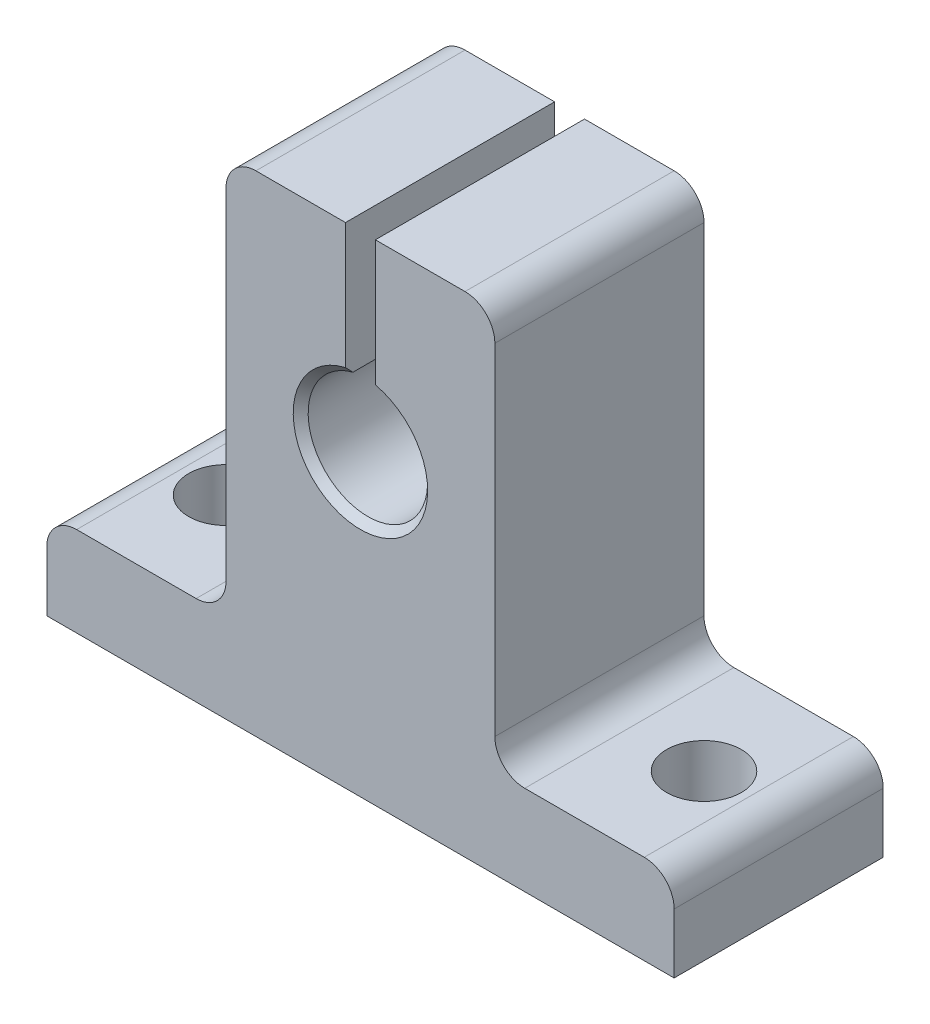
ISO-10303-21;
HEADER;
FILE_DESCRIPTION(('STEP AP214'),'2;1');
FILE_NAME('part.step','',(''),(''),'','','');
FILE_SCHEMA(('AUTOMOTIVE_DESIGN { 1 0 10303 214 1 1 1 1 }'));
ENDSEC;
DATA;
#1=APPLICATION_CONTEXT('core data for automotive mechanical design processes');
#2=APPLICATION_PROTOCOL_DEFINITION('international standard','automotive_design',2000,#1);
#3=PRODUCT_CONTEXT('',#1,'mechanical');
#4=PRODUCT('Part','Part','',(#3));
#5=PRODUCT_RELATED_PRODUCT_CATEGORY('part','',(#4));
#6=PRODUCT_DEFINITION_FORMATION('','',#4);
#7=PRODUCT_DEFINITION_CONTEXT('part definition',#1,'design');
#8=PRODUCT_DEFINITION('design','',#6,#7);
#9=PRODUCT_DEFINITION_SHAPE('','',#8);
#10=(LENGTH_UNIT() NAMED_UNIT(*) SI_UNIT(.MILLI.,.METRE.));
#11=(NAMED_UNIT(*) PLANE_ANGLE_UNIT() SI_UNIT($,.RADIAN.));
#12=(NAMED_UNIT(*) SI_UNIT($,.STERADIAN.) SOLID_ANGLE_UNIT());
#13=UNCERTAINTY_MEASURE_WITH_UNIT(LENGTH_MEASURE(1.E-05),#10,'distance_accuracy_value','');
#14=(GEOMETRIC_REPRESENTATION_CONTEXT(3) GLOBAL_UNCERTAINTY_ASSIGNED_CONTEXT((#13)) GLOBAL_UNIT_ASSIGNED_CONTEXT((#10,
#11,#12)) REPRESENTATION_CONTEXT('',''));
#15=CARTESIAN_POINT('',(0.,0.,0.));
#16=DIRECTION('',(0.,0.,1.));
#17=DIRECTION('',(1.,0.,0.));
#18=AXIS2_PLACEMENT_3D('',#15,#16,#17);
#19=CARTESIAN_POINT('',(-21.,0.,14.));
#20=DIRECTION('',(0.,1.,0.));
#21=DIRECTION('',(-1.,0.,0.));
#22=AXIS2_PLACEMENT_3D('',#19,#20,#21);
#23=PLANE('',#22);
#24=CARTESIAN_POINT('',(-16.,0.,7.));
#25=DIRECTION('',(0.,1.,0.));
#26=DIRECTION('',(0.,0.,1.));
#27=AXIS2_PLACEMENT_3D('',#24,#25,#26);
#28=CIRCLE('',#27,2.5);
#29=CARTESIAN_POINT('',(-16.,0.,9.5));
#30=VERTEX_POINT('',#29);
#31=EDGE_CURVE('E420',#30,#30,#28,.T.);
#32=ORIENTED_EDGE('',*,*,#31,.T.);
#33=EDGE_LOOP('',(#32));
#34=FACE_BOUND('',#33,.T.);
#35=CARTESIAN_POINT('',(16.,0.,7.));
#36=DIRECTION('',(0.,1.,0.));
#37=DIRECTION('',(0.,0.,1.));
#38=AXIS2_PLACEMENT_3D('',#35,#36,#37);
#39=CIRCLE('',#38,2.5);
#40=CARTESIAN_POINT('',(16.,0.,9.5));
#41=VERTEX_POINT('',#40);
#42=EDGE_CURVE('E413',#41,#41,#39,.T.);
#43=ORIENTED_EDGE('',*,*,#42,.T.);
#44=EDGE_LOOP('',(#43));
#45=FACE_BOUND('',#44,.T.);
#46=DIRECTION('',(1.,0.,0.));
#47=VECTOR('',#46,1.);
#48=CARTESIAN_POINT('',(-21.,0.,0.));
#49=LINE('',#48,#47);
#50=CARTESIAN_POINT('',(-21.,0.,0.));
#51=VERTEX_POINT('',#50);
#52=CARTESIAN_POINT('',(21.,0.,0.));
#53=VERTEX_POINT('',#52);
#54=EDGE_CURVE('E203',#51,#53,#49,.T.);
#55=ORIENTED_EDGE('',*,*,#54,.T.);
#56=DIRECTION('',(0.,0.,-1.));
#57=VECTOR('',#56,1.);
#58=CARTESIAN_POINT('',(21.,0.,14.));
#59=LINE('',#58,#57);
#60=CARTESIAN_POINT('',(21.,0.,14.));
#61=VERTEX_POINT('',#60);
#62=EDGE_CURVE('E184',#61,#53,#59,.T.);
#63=ORIENTED_EDGE('',*,*,#62,.F.);
#64=DIRECTION('',(1.,0.,0.));
#65=VECTOR('',#64,1.);
#66=CARTESIAN_POINT('',(-21.,0.,14.));
#67=LINE('',#66,#65);
#68=CARTESIAN_POINT('',(-21.,0.,14.));
#69=VERTEX_POINT('',#68);
#70=EDGE_CURVE('E191',#69,#61,#67,.T.);
#71=ORIENTED_EDGE('',*,*,#70,.F.);
#72=DIRECTION('',(0.,0.,-1.));
#73=VECTOR('',#72,1.);
#74=CARTESIAN_POINT('',(-21.,0.,14.));
#75=LINE('',#74,#73);
#76=EDGE_CURVE('E330',#69,#51,#75,.T.);
#77=ORIENTED_EDGE('',*,*,#76,.T.);
#78=EDGE_LOOP('',(#55,#63,#71,#77));
#79=FACE_BOUND('',#78,.T.);
#80=ADVANCED_FACE('F38',(#34,#45,#79),#23,.F.);
#81=CARTESIAN_POINT('',(21.,0.,14.));
#82=DIRECTION('',(-1.,0.,0.));
#83=DIRECTION('',(0.,0.,1.));
#84=AXIS2_PLACEMENT_3D('',#81,#82,#83);
#85=PLANE('',#84);
#86=DIRECTION('',(0.,1.,0.));
#87=VECTOR('',#86,1.);
#88=CARTESIAN_POINT('',(21.,0.,0.));
#89=LINE('',#88,#87);
#90=CARTESIAN_POINT('',(21.,4.,0.));
#91=VERTEX_POINT('',#90);
#92=EDGE_CURVE('E380',#53,#91,#89,.T.);
#93=ORIENTED_EDGE('',*,*,#92,.T.);
#94=DIRECTION('',(0.,0.,-1.));
#95=VECTOR('',#94,1.);
#96=CARTESIAN_POINT('',(21.,4.,14.));
#97=LINE('',#96,#95);
#98=CARTESIAN_POINT('',(21.,4.,14.));
#99=VERTEX_POINT('',#98);
#100=EDGE_CURVE('E187',#99,#91,#97,.T.);
#101=ORIENTED_EDGE('',*,*,#100,.F.);
#102=DIRECTION('',(0.,1.,0.));
#103=VECTOR('',#102,1.);
#104=CARTESIAN_POINT('',(21.,0.,14.));
#105=LINE('',#104,#103);
#106=EDGE_CURVE('E180',#61,#99,#105,.T.);
#107=ORIENTED_EDGE('',*,*,#106,.F.);
#108=ORIENTED_EDGE('',*,*,#62,.T.);
#109=EDGE_LOOP('',(#93,#101,#107,#108));
#110=FACE_BOUND('',#109,.T.);
#111=ADVANCED_FACE('F182',(#110),#85,.F.);
#112=CARTESIAN_POINT('',(19.,4.00000000000001,14.));
#113=DIRECTION('',(0.,0.,-1.));
#114=DIRECTION('',(-1.,0.,0.));
#115=AXIS2_PLACEMENT_3D('',#112,#113,#114);
#116=CYLINDRICAL_SURFACE('',#115,2.);
#117=CARTESIAN_POINT('',(19.,4.00000000000001,0.));
#118=DIRECTION('',(0.,0.,1.));
#119=DIRECTION('',(1.,0.,0.));
#120=AXIS2_PLACEMENT_3D('',#117,#118,#119);
#121=CIRCLE('',#120,2.);
#122=CARTESIAN_POINT('',(19.,6.00000000000001,0.));
#123=VERTEX_POINT('',#122);
#124=EDGE_CURVE('E376',#91,#123,#121,.T.);
#125=ORIENTED_EDGE('',*,*,#124,.T.);
#126=DIRECTION('',(0.,0.,-1.));
#127=VECTOR('',#126,1.);
#128=CARTESIAN_POINT('',(19.,6.00000000000001,14.));
#129=LINE('',#128,#127);
#130=CARTESIAN_POINT('',(19.,6.00000000000001,14.));
#131=VERTEX_POINT('',#130);
#132=EDGE_CURVE('E208',#131,#123,#129,.T.);
#133=ORIENTED_EDGE('',*,*,#132,.F.);
#134=CARTESIAN_POINT('',(19.,4.00000000000001,14.));
#135=DIRECTION('',(0.,0.,1.));
#136=DIRECTION('',(1.,0.,0.));
#137=AXIS2_PLACEMENT_3D('',#134,#135,#136);
#138=CIRCLE('',#137,2.);
#139=EDGE_CURVE('E190',#99,#131,#138,.T.);
#140=ORIENTED_EDGE('',*,*,#139,.F.);
#141=ORIENTED_EDGE('',*,*,#100,.T.);
#142=EDGE_LOOP('',(#125,#133,#140,#141));
#143=FACE_BOUND('',#142,.T.);
#144=ADVANCED_FACE('F268',(#143),#116,.T.);
#145=CARTESIAN_POINT('',(19.,6.00000000000001,14.));
#146=DIRECTION('',(0.,-1.,0.));
#147=DIRECTION('',(1.,0.,0.));
#148=AXIS2_PLACEMENT_3D('',#145,#146,#147);
#149=PLANE('',#148);
#150=CARTESIAN_POINT('',(16.,6.00000000000002,7.));
#151=DIRECTION('',(0.,1.,0.));
#152=DIRECTION('',(0.,0.,1.));
#153=AXIS2_PLACEMENT_3D('',#150,#151,#152);
#154=CIRCLE('',#153,2.5);
#155=CARTESIAN_POINT('',(16.,6.00000000000002,9.5));
#156=VERTEX_POINT('',#155);
#157=EDGE_CURVE('E417',#156,#156,#154,.T.);
#158=ORIENTED_EDGE('',*,*,#157,.F.);
#159=EDGE_LOOP('',(#158));
#160=FACE_BOUND('',#159,.T.);
#161=DIRECTION('',(-1.,0.,0.));
#162=VECTOR('',#161,1.);
#163=CARTESIAN_POINT('',(19.,6.00000000000001,0.));
#164=LINE('',#163,#162);
#165=CARTESIAN_POINT('',(11.,6.00000000000001,0.));
#166=VERTEX_POINT('',#165);
#167=EDGE_CURVE('E372',#123,#166,#164,.T.);
#168=ORIENTED_EDGE('',*,*,#167,.T.);
#169=DIRECTION('',(0.,0.,-1.));
#170=VECTOR('',#169,1.);
#171=CARTESIAN_POINT('',(11.,6.00000000000001,14.));
#172=LINE('',#171,#170);
#173=CARTESIAN_POINT('',(11.,6.00000000000001,14.));
#174=VERTEX_POINT('',#173);
#175=EDGE_CURVE('E364',#174,#166,#172,.T.);
#176=ORIENTED_EDGE('',*,*,#175,.F.);
#177=DIRECTION('',(-1.,0.,0.));
#178=VECTOR('',#177,1.);
#179=CARTESIAN_POINT('',(19.,6.00000000000001,14.));
#180=LINE('',#179,#178);
#181=EDGE_CURVE('E373',#131,#174,#180,.T.);
#182=ORIENTED_EDGE('',*,*,#181,.F.);
#183=ORIENTED_EDGE('',*,*,#132,.T.);
#184=EDGE_LOOP('',(#168,#176,#182,#183));
#185=FACE_BOUND('',#184,.T.);
#186=ADVANCED_FACE('F271',(#160,#185),#149,.F.);
#187=CARTESIAN_POINT('',(11.,8.00000000000001,14.));
#188=DIRECTION('',(0.,0.,-1.));
#189=DIRECTION('',(-1.,0.,0.));
#190=AXIS2_PLACEMENT_3D('',#187,#188,#189);
#191=CYLINDRICAL_SURFACE('',#190,2.);
#192=CARTESIAN_POINT('',(11.,8.00000000000001,0.));
#193=DIRECTION('',(0.,0.,-1.));
#194=DIRECTION('',(-1.,0.,0.));
#195=AXIS2_PLACEMENT_3D('',#192,#193,#194);
#196=CIRCLE('',#195,2.);
#197=CARTESIAN_POINT('',(9.,8.00000000000002,0.));
#198=VERTEX_POINT('',#197);
#199=EDGE_CURVE('E377',#166,#198,#196,.T.);
#200=ORIENTED_EDGE('',*,*,#199,.T.);
#201=DIRECTION('',(0.,0.,-1.));
#202=VECTOR('',#201,1.);
#203=CARTESIAN_POINT('',(9.,8.00000000000002,14.));
#204=LINE('',#203,#202);
#205=CARTESIAN_POINT('',(9.,8.00000000000002,14.));
#206=VERTEX_POINT('',#205);
#207=EDGE_CURVE('E361',#206,#198,#204,.T.);
#208=ORIENTED_EDGE('',*,*,#207,.F.);
#209=CARTESIAN_POINT('',(11.,8.00000000000001,14.));
#210=DIRECTION('',(0.,0.,-1.));
#211=DIRECTION('',(-1.,0.,0.));
#212=AXIS2_PLACEMENT_3D('',#209,#210,#211);
#213=CIRCLE('',#212,2.);
#214=EDGE_CURVE('E387',#174,#206,#213,.T.);
#215=ORIENTED_EDGE('',*,*,#214,.F.);
#216=ORIENTED_EDGE('',*,*,#175,.T.);
#217=EDGE_LOOP('',(#200,#208,#215,#216));
#218=FACE_BOUND('',#217,.T.);
#219=ADVANCED_FACE('F275',(#218),#191,.F.);
#220=CARTESIAN_POINT('',(9.,8.00000000000002,14.));
#221=DIRECTION('',(-1.,0.,0.));
#222=DIRECTION('',(0.,-1.,0.));
#223=AXIS2_PLACEMENT_3D('',#220,#221,#222);
#224=PLANE('',#223);
#225=DIRECTION('',(0.,1.,0.));
#226=VECTOR('',#225,1.);
#227=CARTESIAN_POINT('',(9.,8.00000000000002,0.));
#228=LINE('',#227,#226);
#229=CARTESIAN_POINT('',(9.,30.8,0.));
#230=VERTEX_POINT('',#229);
#231=EDGE_CURVE('E303',#198,#230,#228,.T.);
#232=ORIENTED_EDGE('',*,*,#231,.T.);
#233=DIRECTION('',(0.,0.,-1.));
#234=VECTOR('',#233,1.);
#235=CARTESIAN_POINT('',(9.,30.8,14.));
#236=LINE('',#235,#234);
#237=CARTESIAN_POINT('',(9.,30.8,14.));
#238=VERTEX_POINT('',#237);
#239=EDGE_CURVE('E299',#238,#230,#236,.T.);
#240=ORIENTED_EDGE('',*,*,#239,.F.);
#241=DIRECTION('',(0.,1.,0.));
#242=VECTOR('',#241,1.);
#243=CARTESIAN_POINT('',(9.,8.00000000000002,14.));
#244=LINE('',#243,#242);
#245=EDGE_CURVE('E385',#206,#238,#244,.T.);
#246=ORIENTED_EDGE('',*,*,#245,.F.);
#247=ORIENTED_EDGE('',*,*,#207,.T.);
#248=EDGE_LOOP('',(#232,#240,#246,#247));
#249=FACE_BOUND('',#248,.T.);
#250=ADVANCED_FACE('F279',(#249),#224,.F.);
#251=CARTESIAN_POINT('',(7.,30.8,14.));
#252=DIRECTION('',(0.,0.,-1.));
#253=DIRECTION('',(-1.,0.,0.));
#254=AXIS2_PLACEMENT_3D('',#251,#252,#253);
#255=CYLINDRICAL_SURFACE('',#254,2.);
#256=CARTESIAN_POINT('',(7.,30.8,0.));
#257=DIRECTION('',(0.,0.,1.));
#258=DIRECTION('',(1.,0.,0.));
#259=AXIS2_PLACEMENT_3D('',#256,#257,#258);
#260=CIRCLE('',#259,2.);
#261=CARTESIAN_POINT('',(6.99999999999999,32.8,0.));
#262=VERTEX_POINT('',#261);
#263=EDGE_CURVE('E293',#230,#262,#260,.T.);
#264=ORIENTED_EDGE('',*,*,#263,.T.);
#265=DIRECTION('',(0.,0.,-1.));
#266=VECTOR('',#265,1.);
#267=CARTESIAN_POINT('',(6.99999999999999,32.8,14.));
#268=LINE('',#267,#266);
#269=CARTESIAN_POINT('',(6.99999999999999,32.8,14.));
#270=VERTEX_POINT('',#269);
#271=EDGE_CURVE('E296',#270,#262,#268,.T.);
#272=ORIENTED_EDGE('',*,*,#271,.F.);
#273=CARTESIAN_POINT('',(7.,30.8,14.));
#274=DIRECTION('',(0.,0.,1.));
#275=DIRECTION('',(1.,0.,0.));
#276=AXIS2_PLACEMENT_3D('',#273,#274,#275);
#277=CIRCLE('',#276,2.);
#278=EDGE_CURVE('E389',#238,#270,#277,.T.);
#279=ORIENTED_EDGE('',*,*,#278,.F.);
#280=ORIENTED_EDGE('',*,*,#239,.T.);
#281=EDGE_LOOP('',(#264,#272,#279,#280));
#282=FACE_BOUND('',#281,.T.);
#283=ADVANCED_FACE('F282',(#282),#255,.T.);
#284=CARTESIAN_POINT('',(6.99999999999999,32.8,14.));
#285=DIRECTION('',(0.,-1.,0.));
#286=DIRECTION('',(0.,0.,-1.));
#287=AXIS2_PLACEMENT_3D('',#284,#285,#286);
#288=PLANE('',#287);
#289=DIRECTION('',(-1.,0.,0.));
#290=VECTOR('',#289,1.);
#291=CARTESIAN_POINT('',(6.99999999999999,32.8,0.));
#292=LINE('',#291,#290);
#293=CARTESIAN_POINT('',(1.,32.8,0.));
#294=VERTEX_POINT('',#293);
#295=EDGE_CURVE('E302',#262,#294,#292,.T.);
#296=ORIENTED_EDGE('',*,*,#295,.T.);
#297=DIRECTION('',(0.,0.,-1.));
#298=VECTOR('',#297,1.);
#299=CARTESIAN_POINT('',(1.,32.8,14.));
#300=LINE('',#299,#298);
#301=CARTESIAN_POINT('',(1.,32.8,14.));
#302=VERTEX_POINT('',#301);
#303=EDGE_CURVE('E308',#302,#294,#300,.T.);
#304=ORIENTED_EDGE('',*,*,#303,.F.);
#305=DIRECTION('',(-1.,0.,0.));
#306=VECTOR('',#305,1.);
#307=CARTESIAN_POINT('',(6.99999999999999,32.8,14.));
#308=LINE('',#307,#306);
#309=EDGE_CURVE('E307',#270,#302,#308,.T.);
#310=ORIENTED_EDGE('',*,*,#309,.F.);
#311=ORIENTED_EDGE('',*,*,#271,.T.);
#312=EDGE_LOOP('',(#296,#304,#310,#311));
#313=FACE_BOUND('',#312,.T.);
#314=ADVANCED_FACE('F244',(#313),#288,.F.);
#315=CARTESIAN_POINT('',(1.,32.8,14.));
#316=DIRECTION('',(1.,0.,0.));
#317=DIRECTION('',(0.,1.,0.));
#318=AXIS2_PLACEMENT_3D('',#315,#316,#317);
#319=PLANE('',#318);
#320=DIRECTION('',(0.,-1.,0.));
#321=VECTOR('',#320,1.);
#322=CARTESIAN_POINT('',(1.,32.8,0.));
#323=LINE('',#322,#321);
#324=CARTESIAN_POINT('',(1.,24.3874821936961,0.));
#325=VERTEX_POINT('',#324);
#326=EDGE_CURVE('E310',#294,#325,#323,.T.);
#327=ORIENTED_EDGE('',*,*,#326,.T.);
#328=CARTESIAN_POINT('',(1.,24.3874821936961,0.));
#329=CARTESIAN_POINT('',(1.,24.3018765373713,0.0834816574370418));
#330=CARTESIAN_POINT('',(1.,24.2161988071415,0.166889150991901));
#331=CARTESIAN_POINT('',(1.,24.0446991913246,0.333555817671619));
#332=CARTESIAN_POINT('',(1.,23.9588773057249,0.416814990783423));
#333=CARTESIAN_POINT('',(1.,23.8729833462074,0.49999999999999));
#334=B_SPLINE_CURVE_WITH_KNOTS('',3,(#328,#329,#330,#331,#332,#333),.UNSPECIFIED.,.F.,.F.,(4,2,
4),(0.,0.358716254086655,0.717432539744777),.UNSPECIFIED.);
#335=CARTESIAN_POINT('',(1.,23.8729833462074,0.49999999999999));
#336=VERTEX_POINT('',#335);
#337=EDGE_CURVE('E47',#325,#336,#334,.T.);
#338=ORIENTED_EDGE('',*,*,#337,.T.);
#339=DIRECTION('',(0.,0.,-1.));
#340=VECTOR('',#339,1.);
#341=CARTESIAN_POINT('',(1.,23.8729833462074,14.));
#342=LINE('',#341,#340);
#343=CARTESIAN_POINT('',(1.,23.8729833462074,13.5));
#344=VERTEX_POINT('',#343);
#345=EDGE_CURVE('E356',#344,#336,#342,.T.);
#346=ORIENTED_EDGE('',*,*,#345,.F.);
#347=CARTESIAN_POINT('',(1.,23.8729833462074,13.5));
#348=CARTESIAN_POINT('',(1.,23.9588773057249,13.5831850092166));
#349=CARTESIAN_POINT('',(1.,24.0446991913246,13.6664441823284));
#350=CARTESIAN_POINT('',(1.,24.2161988071415,13.8331108490081));
#351=CARTESIAN_POINT('',(1.,24.3018765373713,13.916518342563));
#352=CARTESIAN_POINT('',(1.,24.3874821936961,14.));
#353=B_SPLINE_CURVE_WITH_KNOTS('',3,(#347,#348,#349,#350,#351,#352),.UNSPECIFIED.,.F.,.F.,(4,2,
4),(0.,0.358716285658125,0.717432539744782),.UNSPECIFIED.);
#354=CARTESIAN_POINT('',(1.,24.3874821936961,14.));
#355=VERTEX_POINT('',#354);
#356=EDGE_CURVE('E54',#344,#355,#353,.T.);
#357=ORIENTED_EDGE('',*,*,#356,.T.);
#358=DIRECTION('',(0.,-1.,0.));
#359=VECTOR('',#358,1.);
#360=CARTESIAN_POINT('',(1.,32.8,14.));
#361=LINE('',#360,#359);
#362=EDGE_CURVE('E396',#302,#355,#361,.T.);
#363=ORIENTED_EDGE('',*,*,#362,.F.);
#364=ORIENTED_EDGE('',*,*,#303,.T.);
#365=EDGE_LOOP('',(#327,#338,#346,#357,#363,#364));
#366=FACE_BOUND('',#365,.T.);
#367=ADVANCED_FACE('F239',(#366),#319,.F.);
#368=CARTESIAN_POINT('',(0.,20.,14.));
#369=DIRECTION('',(0.,0.,-1.));
#370=DIRECTION('',(-1.,0.,0.));
#371=AXIS2_PLACEMENT_3D('',#368,#369,#370);
#372=CYLINDRICAL_SURFACE('',#371,4.);
#373=ORIENTED_EDGE('',*,*,#345,.T.);
#374=CARTESIAN_POINT('',(0.,20.,0.49999999999999));
#375=DIRECTION('',(0.,0.,1.));
#376=DIRECTION('',(1.,0.,0.));
#377=AXIS2_PLACEMENT_3D('',#374,#375,#376);
#378=CIRCLE('',#377,4.);
#379=CARTESIAN_POINT('',(-1.,23.8729833462074,0.49999999999999));
#380=VERTEX_POINT('',#379);
#381=EDGE_CURVE('E206',#336,#380,#378,.F.);
#382=ORIENTED_EDGE('',*,*,#381,.T.);
#383=DIRECTION('',(0.,0.,-1.));
#384=VECTOR('',#383,1.);
#385=CARTESIAN_POINT('',(-1.,23.8729833462074,14.));
#386=LINE('',#385,#384);
#387=CARTESIAN_POINT('',(-1.,23.8729833462074,13.5));
#388=VERTEX_POINT('',#387);
#389=EDGE_CURVE('E353',#388,#380,#386,.T.);
#390=ORIENTED_EDGE('',*,*,#389,.F.);
#391=CARTESIAN_POINT('',(0.,20.,13.5));
#392=DIRECTION('',(0.,0.,1.));
#393=DIRECTION('',(1.,0.,0.));
#394=AXIS2_PLACEMENT_3D('',#391,#392,#393);
#395=CIRCLE('',#394,4.);
#396=EDGE_CURVE('E204',#388,#344,#395,.T.);
#397=ORIENTED_EDGE('',*,*,#396,.T.);
#398=EDGE_LOOP('',(#373,#382,#390,#397));
#399=FACE_BOUND('',#398,.T.);
#400=ADVANCED_FACE('F233',(#399),#372,.F.);
#401=CARTESIAN_POINT('',(-1.,23.8729833462074,14.));
#402=DIRECTION('',(-1.,0.,0.));
#403=DIRECTION('',(0.,-1.,0.));
#404=AXIS2_PLACEMENT_3D('',#401,#402,#403);
#405=PLANE('',#404);
#406=ORIENTED_EDGE('',*,*,#389,.T.);
#407=CARTESIAN_POINT('',(-1.,23.8729833462074,0.49999999999999));
#408=CARTESIAN_POINT('',(-1.,23.9588773057249,0.416814990783423));
#409=CARTESIAN_POINT('',(-1.,24.0446991913246,0.33355581767162));
#410=CARTESIAN_POINT('',(-1.,24.2161988071415,0.166889150991902));
#411=CARTESIAN_POINT('',(-1.,24.3018765373713,0.0834816574370422));
#412=CARTESIAN_POINT('',(-1.,24.3874821936961,0.));
#413=B_SPLINE_CURVE_WITH_KNOTS('',3,(#407,#408,#409,#410,#411,#412),.UNSPECIFIED.,.F.,.F.,(4,2,
4),(0.,0.358716285658122,0.717432539744777),.UNSPECIFIED.);
#414=CARTESIAN_POINT('',(-1.,24.3874821936961,0.));
#415=VERTEX_POINT('',#414);
#416=EDGE_CURVE('E221',#380,#415,#413,.T.);
#417=ORIENTED_EDGE('',*,*,#416,.T.);
#418=DIRECTION('',(0.,1.,0.));
#419=VECTOR('',#418,1.);
#420=CARTESIAN_POINT('',(-1.,23.8729833462074,0.));
#421=LINE('',#420,#419);
#422=CARTESIAN_POINT('',(-1.,32.8,0.));
#423=VERTEX_POINT('',#422);
#424=EDGE_CURVE('E312',#415,#423,#421,.T.);
#425=ORIENTED_EDGE('',*,*,#424,.T.);
#426=DIRECTION('',(0.,0.,-1.));
#427=VECTOR('',#426,1.);
#428=CARTESIAN_POINT('',(-1.,32.8,14.));
#429=LINE('',#428,#427);
#430=CARTESIAN_POINT('',(-1.,32.8,14.));
#431=VERTEX_POINT('',#430);
#432=EDGE_CURVE('E350',#431,#423,#429,.T.);
#433=ORIENTED_EDGE('',*,*,#432,.F.);
#434=DIRECTION('',(0.,1.,0.));
#435=VECTOR('',#434,1.);
#436=CARTESIAN_POINT('',(-1.,23.8729833462074,14.));
#437=LINE('',#436,#435);
#438=CARTESIAN_POINT('',(-1.,24.3874821936961,14.));
#439=VERTEX_POINT('',#438);
#440=EDGE_CURVE('E398',#439,#431,#437,.T.);
#441=ORIENTED_EDGE('',*,*,#440,.F.);
#442=CARTESIAN_POINT('',(-1.,24.3874821936961,14.));
#443=CARTESIAN_POINT('',(-1.,24.3018765373713,13.916518342563));
#444=CARTESIAN_POINT('',(-1.,24.2161988071415,13.8331108490081));
#445=CARTESIAN_POINT('',(-1.,24.0446991913246,13.6664441823284));
#446=CARTESIAN_POINT('',(-1.,23.9588773057249,13.5831850092166));
#447=CARTESIAN_POINT('',(-1.,23.8729833462074,13.5));
#448=B_SPLINE_CURVE_WITH_KNOTS('',3,(#442,#443,#444,#445,#446,#447),.UNSPECIFIED.,.F.,.F.,(4,2,
4),(0.,0.358716254086658,0.717432539744783),.UNSPECIFIED.);
#449=EDGE_CURVE('E214',#439,#388,#448,.T.);
#450=ORIENTED_EDGE('',*,*,#449,.T.);
#451=EDGE_LOOP('',(#406,#417,#425,#433,#441,#450));
#452=FACE_BOUND('',#451,.T.);
#453=ADVANCED_FACE('F227',(#452),#405,.F.);
#454=CARTESIAN_POINT('',(-1.,32.8,14.));
#455=DIRECTION('',(0.,-1.,0.));
#456=DIRECTION('',(1.,0.,0.));
#457=AXIS2_PLACEMENT_3D('',#454,#455,#456);
#458=PLANE('',#457);
#459=DIRECTION('',(-1.,0.,0.));
#460=VECTOR('',#459,1.);
#461=CARTESIAN_POINT('',(-1.,32.8,0.));
#462=LINE('',#461,#460);
#463=CARTESIAN_POINT('',(-6.99999999999999,32.8,0.));
#464=VERTEX_POINT('',#463);
#465=EDGE_CURVE('E317',#423,#464,#462,.T.);
#466=ORIENTED_EDGE('',*,*,#465,.T.);
#467=DIRECTION('',(0.,0.,-1.));
#468=VECTOR('',#467,1.);
#469=CARTESIAN_POINT('',(-6.99999999999999,32.8,14.));
#470=LINE('',#469,#468);
#471=CARTESIAN_POINT('',(-6.99999999999999,32.8,14.));
#472=VERTEX_POINT('',#471);
#473=EDGE_CURVE('E347',#472,#464,#470,.T.);
#474=ORIENTED_EDGE('',*,*,#473,.F.);
#475=DIRECTION('',(-1.,0.,0.));
#476=VECTOR('',#475,1.);
#477=CARTESIAN_POINT('',(-1.,32.8,14.));
#478=LINE('',#477,#476);
#479=EDGE_CURVE('E400',#431,#472,#478,.T.);
#480=ORIENTED_EDGE('',*,*,#479,.F.);
#481=ORIENTED_EDGE('',*,*,#432,.T.);
#482=EDGE_LOOP('',(#466,#474,#480,#481));
#483=FACE_BOUND('',#482,.T.);
#484=ADVANCED_FACE('F232',(#483),#458,.F.);
#485=CARTESIAN_POINT('',(-7.,30.8,14.));
#486=DIRECTION('',(0.,0.,-1.));
#487=DIRECTION('',(-1.,0.,0.));
#488=AXIS2_PLACEMENT_3D('',#485,#486,#487);
#489=CYLINDRICAL_SURFACE('',#488,2.);
#490=CARTESIAN_POINT('',(-7.,30.8,0.));
#491=DIRECTION('',(0.,0.,1.));
#492=DIRECTION('',(1.,0.,0.));
#493=AXIS2_PLACEMENT_3D('',#490,#491,#492);
#494=CIRCLE('',#493,2.);
#495=CARTESIAN_POINT('',(-9.,30.8,0.));
#496=VERTEX_POINT('',#495);
#497=EDGE_CURVE('E319',#464,#496,#494,.T.);
#498=ORIENTED_EDGE('',*,*,#497,.T.);
#499=DIRECTION('',(0.,0.,-1.));
#500=VECTOR('',#499,1.);
#501=CARTESIAN_POINT('',(-9.,30.8,14.));
#502=LINE('',#501,#500);
#503=CARTESIAN_POINT('',(-9.,30.8,14.));
#504=VERTEX_POINT('',#503);
#505=EDGE_CURVE('E344',#504,#496,#502,.T.);
#506=ORIENTED_EDGE('',*,*,#505,.F.);
#507=CARTESIAN_POINT('',(-7.,30.8,14.));
#508=DIRECTION('',(0.,0.,1.));
#509=DIRECTION('',(1.,0.,0.));
#510=AXIS2_PLACEMENT_3D('',#507,#508,#509);
#511=CIRCLE('',#510,2.);
#512=EDGE_CURVE('E402',#472,#504,#511,.T.);
#513=ORIENTED_EDGE('',*,*,#512,.F.);
#514=ORIENTED_EDGE('',*,*,#473,.T.);
#515=EDGE_LOOP('',(#498,#506,#513,#514));
#516=FACE_BOUND('',#515,.T.);
#517=ADVANCED_FACE('F462',(#516),#489,.T.);
#518=CARTESIAN_POINT('',(-9.,30.8,14.));
#519=DIRECTION('',(1.,0.,0.));
#520=DIRECTION('',(0.,1.,0.));
#521=AXIS2_PLACEMENT_3D('',#518,#519,#520);
#522=PLANE('',#521);
#523=DIRECTION('',(0.,-1.,0.));
#524=VECTOR('',#523,1.);
#525=CARTESIAN_POINT('',(-9.,30.8,0.));
#526=LINE('',#525,#524);
#527=CARTESIAN_POINT('',(-9.,8.00000000000002,0.));
#528=VERTEX_POINT('',#527);
#529=EDGE_CURVE('E321',#496,#528,#526,.T.);
#530=ORIENTED_EDGE('',*,*,#529,.T.);
#531=DIRECTION('',(0.,0.,-1.));
#532=VECTOR('',#531,1.);
#533=CARTESIAN_POINT('',(-9.,8.00000000000002,14.));
#534=LINE('',#533,#532);
#535=CARTESIAN_POINT('',(-9.,8.00000000000002,14.));
#536=VERTEX_POINT('',#535);
#537=EDGE_CURVE('E341',#536,#528,#534,.T.);
#538=ORIENTED_EDGE('',*,*,#537,.F.);
#539=DIRECTION('',(0.,-1.,0.));
#540=VECTOR('',#539,1.);
#541=CARTESIAN_POINT('',(-9.,30.8,14.));
#542=LINE('',#541,#540);
#543=EDGE_CURVE('E404',#504,#536,#542,.T.);
#544=ORIENTED_EDGE('',*,*,#543,.F.);
#545=ORIENTED_EDGE('',*,*,#505,.T.);
#546=EDGE_LOOP('',(#530,#538,#544,#545));
#547=FACE_BOUND('',#546,.T.);
#548=ADVANCED_FACE('F459',(#547),#522,.F.);
#549=CARTESIAN_POINT('',(-11.,8.00000000000001,14.));
#550=DIRECTION('',(0.,0.,-1.));
#551=DIRECTION('',(-1.,0.,0.));
#552=AXIS2_PLACEMENT_3D('',#549,#550,#551);
#553=CYLINDRICAL_SURFACE('',#552,2.);
#554=CARTESIAN_POINT('',(-11.,8.00000000000001,0.));
#555=DIRECTION('',(0.,0.,-1.));
#556=DIRECTION('',(-1.,0.,0.));
#557=AXIS2_PLACEMENT_3D('',#554,#555,#556);
#558=CIRCLE('',#557,2.);
#559=CARTESIAN_POINT('',(-11.,6.00000000000001,0.));
#560=VERTEX_POINT('',#559);
#561=EDGE_CURVE('E323',#528,#560,#558,.T.);
#562=ORIENTED_EDGE('',*,*,#561,.T.);
#563=DIRECTION('',(0.,0.,-1.));
#564=VECTOR('',#563,1.);
#565=CARTESIAN_POINT('',(-11.,6.00000000000001,14.));
#566=LINE('',#565,#564);
#567=CARTESIAN_POINT('',(-11.,6.00000000000001,14.));
#568=VERTEX_POINT('',#567);
#569=EDGE_CURVE('E338',#568,#560,#566,.T.);
#570=ORIENTED_EDGE('',*,*,#569,.F.);
#571=CARTESIAN_POINT('',(-11.,8.00000000000001,14.));
#572=DIRECTION('',(0.,0.,-1.));
#573=DIRECTION('',(-1.,0.,0.));
#574=AXIS2_PLACEMENT_3D('',#571,#572,#573);
#575=CIRCLE('',#574,2.);
#576=EDGE_CURVE('E406',#536,#568,#575,.T.);
#577=ORIENTED_EDGE('',*,*,#576,.F.);
#578=ORIENTED_EDGE('',*,*,#537,.T.);
#579=EDGE_LOOP('',(#562,#570,#577,#578));
#580=FACE_BOUND('',#579,.T.);
#581=ADVANCED_FACE('F433',(#580),#553,.F.);
#582=CARTESIAN_POINT('',(-11.,6.00000000000001,14.));
#583=DIRECTION('',(0.,-1.,0.));
#584=DIRECTION('',(1.,0.,0.));
#585=AXIS2_PLACEMENT_3D('',#582,#583,#584);
#586=PLANE('',#585);
#587=CARTESIAN_POINT('',(-16.,6.,7.));
#588=DIRECTION('',(0.,1.,0.));
#589=DIRECTION('',(0.,0.,1.));
#590=AXIS2_PLACEMENT_3D('',#587,#588,#589);
#591=CIRCLE('',#590,2.5);
#592=CARTESIAN_POINT('',(-16.,6.,9.5));
#593=VERTEX_POINT('',#592);
#594=EDGE_CURVE('E423',#593,#593,#591,.T.);
#595=ORIENTED_EDGE('',*,*,#594,.F.);
#596=EDGE_LOOP('',(#595));
#597=FACE_BOUND('',#596,.T.);
#598=DIRECTION('',(-1.,0.,0.));
#599=VECTOR('',#598,1.);
#600=CARTESIAN_POINT('',(-11.,6.00000000000001,0.));
#601=LINE('',#600,#599);
#602=CARTESIAN_POINT('',(-19.,6.,0.));
#603=VERTEX_POINT('',#602);
#604=EDGE_CURVE('E325',#560,#603,#601,.T.);
#605=ORIENTED_EDGE('',*,*,#604,.T.);
#606=DIRECTION('',(0.,0.,-1.));
#607=VECTOR('',#606,1.);
#608=CARTESIAN_POINT('',(-19.,6.,14.));
#609=LINE('',#608,#607);
#610=CARTESIAN_POINT('',(-19.,6.,14.));
#611=VERTEX_POINT('',#610);
#612=EDGE_CURVE('E335',#611,#603,#609,.T.);
#613=ORIENTED_EDGE('',*,*,#612,.F.);
#614=DIRECTION('',(-1.,0.,0.));
#615=VECTOR('',#614,1.);
#616=CARTESIAN_POINT('',(-11.,6.00000000000001,14.));
#617=LINE('',#616,#615);
#618=EDGE_CURVE('E408',#568,#611,#617,.T.);
#619=ORIENTED_EDGE('',*,*,#618,.F.);
#620=ORIENTED_EDGE('',*,*,#569,.T.);
#621=EDGE_LOOP('',(#605,#613,#619,#620));
#622=FACE_BOUND('',#621,.T.);
#623=ADVANCED_FACE('F429',(#597,#622),#586,.F.);
#624=CARTESIAN_POINT('',(-19.,4.,14.));
#625=DIRECTION('',(0.,0.,-1.));
#626=DIRECTION('',(-1.,0.,0.));
#627=AXIS2_PLACEMENT_3D('',#624,#625,#626);
#628=CYLINDRICAL_SURFACE('',#627,2.);
#629=CARTESIAN_POINT('',(-19.,4.,0.));
#630=DIRECTION('',(0.,0.,1.));
#631=DIRECTION('',(-1.,0.,0.));
#632=AXIS2_PLACEMENT_3D('',#629,#630,#631);
#633=CIRCLE('',#632,2.);
#634=CARTESIAN_POINT('',(-21.,3.99999999999999,0.));
#635=VERTEX_POINT('',#634);
#636=EDGE_CURVE('E327',#603,#635,#633,.T.);
#637=ORIENTED_EDGE('',*,*,#636,.T.);
#638=DIRECTION('',(0.,0.,-1.));
#639=VECTOR('',#638,1.);
#640=CARTESIAN_POINT('',(-21.,3.99999999999999,14.));
#641=LINE('',#640,#639);
#642=CARTESIAN_POINT('',(-21.,3.99999999999999,14.));
#643=VERTEX_POINT('',#642);
#644=EDGE_CURVE('E332',#643,#635,#641,.T.);
#645=ORIENTED_EDGE('',*,*,#644,.F.);
#646=CARTESIAN_POINT('',(-19.,4.,14.));
#647=DIRECTION('',(0.,0.,1.));
#648=DIRECTION('',(-1.,0.,0.));
#649=AXIS2_PLACEMENT_3D('',#646,#647,#648);
#650=CIRCLE('',#649,2.);
#651=EDGE_CURVE('E410',#611,#643,#650,.T.);
#652=ORIENTED_EDGE('',*,*,#651,.F.);
#653=ORIENTED_EDGE('',*,*,#612,.T.);
#654=EDGE_LOOP('',(#637,#645,#652,#653));
#655=FACE_BOUND('',#654,.T.);
#656=ADVANCED_FACE('F432',(#655),#628,.T.);
#657=CARTESIAN_POINT('',(-21.,3.99999999999999,14.));
#658=DIRECTION('',(1.,0.,0.));
#659=DIRECTION('',(0.,0.,-1.));
#660=AXIS2_PLACEMENT_3D('',#657,#658,#659);
#661=PLANE('',#660);
#662=DIRECTION('',(0.,-1.,0.));
#663=VECTOR('',#662,1.);
#664=CARTESIAN_POINT('',(-21.,3.99999999999999,0.));
#665=LINE('',#664,#663);
#666=EDGE_CURVE('E200',#635,#51,#665,.T.);
#667=ORIENTED_EDGE('',*,*,#666,.T.);
#668=ORIENTED_EDGE('',*,*,#76,.F.);
#669=DIRECTION('',(0.,-1.,0.));
#670=VECTOR('',#669,1.);
#671=CARTESIAN_POINT('',(-21.,3.99999999999999,14.));
#672=LINE('',#671,#670);
#673=EDGE_CURVE('E196',#643,#69,#672,.T.);
#674=ORIENTED_EDGE('',*,*,#673,.F.);
#675=ORIENTED_EDGE('',*,*,#644,.T.);
#676=EDGE_LOOP('',(#667,#668,#674,#675));
#677=FACE_BOUND('',#676,.T.);
#678=ADVANCED_FACE('F446',(#677),#661,.F.);
#679=CARTESIAN_POINT('',(19.,4.00000000000001,14.));
#680=DIRECTION('',(0.,0.,1.));
#681=DIRECTION('',(1.,0.,0.));
#682=AXIS2_PLACEMENT_3D('',#679,#680,#681);
#683=PLANE('',#682);
#684=ORIENTED_EDGE('',*,*,#362,.T.);
#685=CARTESIAN_POINT('',(0.,20.,14.));
#686=DIRECTION('',(0.,0.,1.));
#687=DIRECTION('',(1.,0.,0.));
#688=AXIS2_PLACEMENT_3D('',#685,#686,#687);
#689=CIRCLE('',#688,4.49999999999999);
#690=EDGE_CURVE('E11',#355,#439,#689,.F.);
#691=ORIENTED_EDGE('',*,*,#690,.T.);
#692=ORIENTED_EDGE('',*,*,#440,.T.);
#693=ORIENTED_EDGE('',*,*,#479,.T.);
#694=ORIENTED_EDGE('',*,*,#512,.T.);
#695=ORIENTED_EDGE('',*,*,#543,.T.);
#696=ORIENTED_EDGE('',*,*,#576,.T.);
#697=ORIENTED_EDGE('',*,*,#618,.T.);
#698=ORIENTED_EDGE('',*,*,#651,.T.);
#699=ORIENTED_EDGE('',*,*,#673,.T.);
#700=ORIENTED_EDGE('',*,*,#70,.T.);
#701=ORIENTED_EDGE('',*,*,#106,.T.);
#702=ORIENTED_EDGE('',*,*,#139,.T.);
#703=ORIENTED_EDGE('',*,*,#181,.T.);
#704=ORIENTED_EDGE('',*,*,#214,.T.);
#705=ORIENTED_EDGE('',*,*,#245,.T.);
#706=ORIENTED_EDGE('',*,*,#278,.T.);
#707=ORIENTED_EDGE('',*,*,#309,.T.);
#708=EDGE_LOOP('',(#684,#691,#692,#693,#694,#695,#696,#697,#698,#699,#700,#701,#702,#703,#704,
#705,#706,#707));
#709=FACE_BOUND('',#708,.T.);
#710=ADVANCED_FACE('F194',(#709),#683,.T.);
#711=CARTESIAN_POINT('',(19.,4.00000000000001,0.));
#712=DIRECTION('',(0.,0.,1.));
#713=DIRECTION('',(1.,0.,0.));
#714=AXIS2_PLACEMENT_3D('',#711,#712,#713);
#715=PLANE('',#714);
#716=ORIENTED_EDGE('',*,*,#424,.F.);
#717=CARTESIAN_POINT('',(0.,20.,0.));
#718=DIRECTION('',(0.,0.,1.));
#719=DIRECTION('',(1.,0.,0.));
#720=AXIS2_PLACEMENT_3D('',#717,#718,#719);
#721=CIRCLE('',#720,4.49999999999999);
#722=EDGE_CURVE('E62',#415,#325,#721,.T.);
#723=ORIENTED_EDGE('',*,*,#722,.T.);
#724=ORIENTED_EDGE('',*,*,#326,.F.);
#725=ORIENTED_EDGE('',*,*,#295,.F.);
#726=ORIENTED_EDGE('',*,*,#263,.F.);
#727=ORIENTED_EDGE('',*,*,#231,.F.);
#728=ORIENTED_EDGE('',*,*,#199,.F.);
#729=ORIENTED_EDGE('',*,*,#167,.F.);
#730=ORIENTED_EDGE('',*,*,#124,.F.);
#731=ORIENTED_EDGE('',*,*,#92,.F.);
#732=ORIENTED_EDGE('',*,*,#54,.F.);
#733=ORIENTED_EDGE('',*,*,#666,.F.);
#734=ORIENTED_EDGE('',*,*,#636,.F.);
#735=ORIENTED_EDGE('',*,*,#604,.F.);
#736=ORIENTED_EDGE('',*,*,#561,.F.);
#737=ORIENTED_EDGE('',*,*,#529,.F.);
#738=ORIENTED_EDGE('',*,*,#497,.F.);
#739=ORIENTED_EDGE('',*,*,#465,.F.);
#740=EDGE_LOOP('',(#716,#723,#724,#725,#726,#727,#728,#729,#730,#731,#732,#733,#734,#735,#736,
#737,#738,#739));
#741=FACE_BOUND('',#740,.T.);
#742=ADVANCED_FACE('F260',(#741),#715,.F.);
#743=CARTESIAN_POINT('',(0.,20.,0.49999999999999));
#744=DIRECTION('',(0.,0.,-1.));
#745=DIRECTION('',(-1.,0.,0.));
#746=AXIS2_PLACEMENT_3D('',#743,#744,#745);
#747=CONICAL_SURFACE('',#746,4.,0.785398163397448);
#748=ORIENTED_EDGE('',*,*,#337,.F.);
#749=ORIENTED_EDGE('',*,*,#722,.F.);
#750=ORIENTED_EDGE('',*,*,#416,.F.);
#751=ORIENTED_EDGE('',*,*,#381,.F.);
#752=EDGE_LOOP('',(#748,#749,#750,#751));
#753=FACE_BOUND('',#752,.T.);
#754=ADVANCED_FACE('F256',(#753),#747,.F.);
#755=CARTESIAN_POINT('',(0.,20.,14.));
#756=DIRECTION('',(0.,0.,1.));
#757=DIRECTION('',(1.,0.,0.));
#758=AXIS2_PLACEMENT_3D('',#755,#756,#757);
#759=CONICAL_SURFACE('',#758,4.49999999999999,0.785398163397441);
#760=ORIENTED_EDGE('',*,*,#356,.F.);
#761=ORIENTED_EDGE('',*,*,#396,.F.);
#762=ORIENTED_EDGE('',*,*,#449,.F.);
#763=ORIENTED_EDGE('',*,*,#690,.F.);
#764=EDGE_LOOP('',(#760,#761,#762,#763));
#765=FACE_BOUND('',#764,.T.);
#766=ADVANCED_FACE('F40',(#765),#759,.F.);
#767=CARTESIAN_POINT('',(16.,6.00000000000002,7.));
#768=DIRECTION('',(0.,1.,0.));
#769=DIRECTION('',(0.,0.,1.));
#770=AXIS2_PLACEMENT_3D('',#767,#768,#769);
#771=CYLINDRICAL_SURFACE('',#770,2.5);
#772=ORIENTED_EDGE('',*,*,#42,.F.);
#773=EDGE_LOOP('',(#772));
#774=FACE_BOUND('',#773,.T.);
#775=ORIENTED_EDGE('',*,*,#157,.T.);
#776=EDGE_LOOP('',(#775));
#777=FACE_BOUND('',#776,.T.);
#778=ADVANCED_FACE('F489',(#774,#777),#771,.F.);
#779=CARTESIAN_POINT('',(-16.,6.,7.));
#780=DIRECTION('',(0.,1.,0.));
#781=DIRECTION('',(0.,0.,1.));
#782=AXIS2_PLACEMENT_3D('',#779,#780,#781);
#783=CYLINDRICAL_SURFACE('',#782,2.5);
#784=ORIENTED_EDGE('',*,*,#31,.F.);
#785=EDGE_LOOP('',(#784));
#786=FACE_BOUND('',#785,.T.);
#787=ORIENTED_EDGE('',*,*,#594,.T.);
#788=EDGE_LOOP('',(#787));
#789=FACE_BOUND('',#788,.T.);
#790=ADVANCED_FACE('F427',(#786,#789),#783,.F.);
#791=CLOSED_SHELL('',(#80,#111,#144,#186,#219,#250,#283,#314,#367,#400,#453,#484,#517,#548,#581,
#623,#656,#678,#710,#742,#754,#766,#778,#790));
#792=MANIFOLD_SOLID_BREP('B2',#791);
#793=ADVANCED_BREP_SHAPE_REPRESENTATION('',(#18,#792),#14);
#794=SHAPE_DEFINITION_REPRESENTATION(#9,#793);
ENDSEC;
END-ISO-10303-21;
